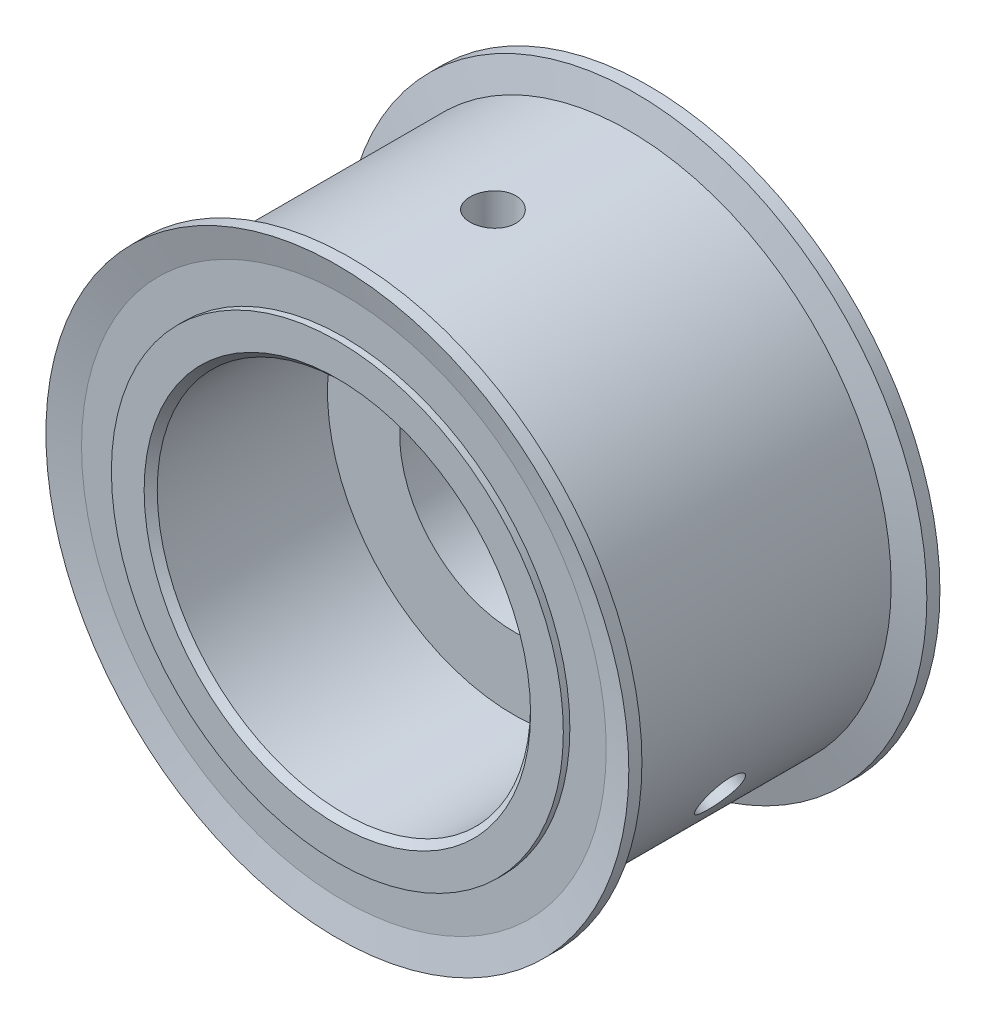
ISO-10303-21;
HEADER;
FILE_DESCRIPTION(('STEP AP214'),'2;1');
FILE_NAME('part.step','',(''),(''),'','','');
FILE_SCHEMA(('AUTOMOTIVE_DESIGN { 1 0 10303 214 1 1 1 1 }'));
ENDSEC;
DATA;
#1=APPLICATION_CONTEXT('core data for automotive mechanical design processes');
#2=APPLICATION_PROTOCOL_DEFINITION('international standard','automotive_design',2000,#1);
#3=PRODUCT_CONTEXT('',#1,'mechanical');
#4=PRODUCT('Part','Part','',(#3));
#5=PRODUCT_RELATED_PRODUCT_CATEGORY('part','',(#4));
#6=PRODUCT_DEFINITION_FORMATION('','',#4);
#7=PRODUCT_DEFINITION_CONTEXT('part definition',#1,'design');
#8=PRODUCT_DEFINITION('design','',#6,#7);
#9=PRODUCT_DEFINITION_SHAPE('','',#8);
#10=(LENGTH_UNIT() NAMED_UNIT(*) SI_UNIT(.MILLI.,.METRE.));
#11=(NAMED_UNIT(*) PLANE_ANGLE_UNIT() SI_UNIT($,.RADIAN.));
#12=(NAMED_UNIT(*) SI_UNIT($,.STERADIAN.) SOLID_ANGLE_UNIT());
#13=UNCERTAINTY_MEASURE_WITH_UNIT(LENGTH_MEASURE(1.E-05),#10,'distance_accuracy_value','');
#14=(GEOMETRIC_REPRESENTATION_CONTEXT(3) GLOBAL_UNCERTAINTY_ASSIGNED_CONTEXT((#13)) GLOBAL_UNIT_ASSIGNED_CONTEXT((#10,
#11,#12)) REPRESENTATION_CONTEXT('',''));
#15=CARTESIAN_POINT('',(0.,0.,0.));
#16=DIRECTION('',(0.,0.,1.));
#17=DIRECTION('',(1.,0.,0.));
#18=AXIS2_PLACEMENT_3D('',#15,#16,#17);
#19=CARTESIAN_POINT('',(0.,30.055,23.75));
#20=DIRECTION('',(0.,-1.,0.));
#21=DIRECTION('',(0.,0.,-1.));
#22=AXIS2_PLACEMENT_3D('',#19,#20,#21);
#23=PLANE('',#22);
#24=CARTESIAN_POINT('',(0.,30.055,23.75));
#25=DIRECTION('',(0.,1.,0.));
#26=DIRECTION('',(0.,0.,1.));
#27=AXIS2_PLACEMENT_3D('',#24,#25,#26);
#28=CIRCLE('',#27,3.5);
#29=CARTESIAN_POINT('',(0.,30.055,27.25));
#30=VERTEX_POINT('',#29);
#31=EDGE_CURVE('E89',#30,#30,#28,.T.);
#32=ORIENTED_EDGE('',*,*,#31,.T.);
#33=EDGE_LOOP('',(#32));
#34=FACE_BOUND('',#33,.T.);
#35=CARTESIAN_POINT('',(0.,30.055,23.75));
#36=DIRECTION('',(0.,1.,0.));
#37=DIRECTION('',(0.,0.,1.));
#38=AXIS2_PLACEMENT_3D('',#35,#36,#37);
#39=CIRCLE('',#38,2.49999999999999);
#40=CARTESIAN_POINT('',(0.,30.055,26.25));
#41=VERTEX_POINT('',#40);
#42=EDGE_CURVE('E90',#41,#41,#39,.T.);
#43=ORIENTED_EDGE('',*,*,#42,.F.);
#44=EDGE_LOOP('',(#43));
#45=FACE_BOUND('',#44,.T.);
#46=ADVANCED_FACE('F32',(#34,#45),#23,.F.);
#47=CARTESIAN_POINT('',(0.,34.5,47.5));
#48=DIRECTION('',(0.,0.,-1.));
#49=DIRECTION('',(-1.,0.,0.));
#50=AXIS2_PLACEMENT_3D('',#47,#48,#49);
#51=PLANE('',#50);
#52=CARTESIAN_POINT('',(0.,0.,47.5));
#53=DIRECTION('',(0.,0.,-1.));
#54=DIRECTION('',(-1.,0.,0.));
#55=AXIS2_PLACEMENT_3D('',#52,#53,#54);
#56=CIRCLE('',#55,29.5);
#57=CARTESIAN_POINT('',(-29.5,0.,47.5));
#58=VERTEX_POINT('',#57);
#59=EDGE_CURVE('E10',#58,#58,#56,.T.);
#60=ORIENTED_EDGE('',*,*,#59,.T.);
#61=EDGE_LOOP('',(#60));
#62=FACE_BOUND('',#61,.T.);
#63=CARTESIAN_POINT('',(0.,0.,47.5));
#64=DIRECTION('',(0.,0.,1.));
#65=DIRECTION('',(1.,0.,0.));
#66=AXIS2_PLACEMENT_3D('',#63,#64,#65);
#67=CIRCLE('',#66,34.5);
#68=CARTESIAN_POINT('',(34.5,0.,47.5));
#69=VERTEX_POINT('',#68);
#70=EDGE_CURVE('E103',#69,#69,#67,.T.);
#71=ORIENTED_EDGE('',*,*,#70,.T.);
#72=EDGE_LOOP('',(#71));
#73=FACE_BOUND('',#72,.T.);
#74=ADVANCED_FACE('F156',(#62,#73),#51,.F.);
#75=CARTESIAN_POINT('',(0.,34.5,0.));
#76=DIRECTION('',(0.,0.,1.));
#77=DIRECTION('',(1.,0.,0.));
#78=AXIS2_PLACEMENT_3D('',#75,#76,#77);
#79=PLANE('',#78);
#80=CARTESIAN_POINT('',(0.,0.,0.));
#81=DIRECTION('',(0.,0.,1.));
#82=DIRECTION('',(1.,0.,0.));
#83=AXIS2_PLACEMENT_3D('',#80,#81,#82);
#84=CIRCLE('',#83,34.5);
#85=CARTESIAN_POINT('',(34.5,0.,0.));
#86=VERTEX_POINT('',#85);
#87=EDGE_CURVE('E135',#86,#86,#84,.T.);
#88=ORIENTED_EDGE('',*,*,#87,.F.);
#89=EDGE_LOOP('',(#88));
#90=FACE_BOUND('',#89,.T.);
#91=CARTESIAN_POINT('',(0.,0.,0.));
#92=DIRECTION('',(0.,0.,1.));
#93=DIRECTION('',(1.,0.,0.));
#94=AXIS2_PLACEMENT_3D('',#91,#92,#93);
#95=CIRCLE('',#94,17.5);
#96=CARTESIAN_POINT('',(17.5,0.,0.));
#97=VERTEX_POINT('',#96);
#98=EDGE_CURVE('E100',#97,#97,#95,.T.);
#99=ORIENTED_EDGE('',*,*,#98,.T.);
#100=EDGE_LOOP('',(#99));
#101=FACE_BOUND('',#100,.T.);
#102=ADVANCED_FACE('F161',(#90,#101),#79,.F.);
#103=CARTESIAN_POINT('',(0.,0.,58.9307236143648));
#104=DIRECTION('',(0.,0.,1.));
#105=DIRECTION('',(1.,0.,0.));
#106=AXIS2_PLACEMENT_3D('',#103,#104,#105);
#107=CYLINDRICAL_SURFACE('',#106,34.5);
#108=CARTESIAN_POINT('',(0.,0.,1.00000000000001));
#109=DIRECTION('',(0.,0.,1.));
#110=DIRECTION('',(1.,0.,0.));
#111=AXIS2_PLACEMENT_3D('',#108,#109,#110);
#112=CIRCLE('',#111,34.5);
#113=CARTESIAN_POINT('',(34.5,0.,1.00000000000001));
#114=VERTEX_POINT('',#113);
#115=EDGE_CURVE('E133',#114,#114,#112,.T.);
#116=ORIENTED_EDGE('',*,*,#115,.F.);
#117=EDGE_LOOP('',(#116));
#118=FACE_BOUND('',#117,.T.);
#119=ORIENTED_EDGE('',*,*,#87,.T.);
#120=EDGE_LOOP('',(#119));
#121=FACE_BOUND('',#120,.T.);
#122=ADVANCED_FACE('F219',(#118,#121),#107,.T.);
#123=CARTESIAN_POINT('',(0.,40.055,1.00000000000001));
#124=DIRECTION('',(0.,0.,1.));
#125=DIRECTION('',(1.,0.,0.));
#126=AXIS2_PLACEMENT_3D('',#123,#124,#125);
#127=PLANE('',#126);
#128=CARTESIAN_POINT('',(0.,0.,1.00000000000001));
#129=DIRECTION('',(0.,0.,1.));
#130=DIRECTION('',(1.,0.,0.));
#131=AXIS2_PLACEMENT_3D('',#128,#129,#130);
#132=CIRCLE('',#131,40.055);
#133=CARTESIAN_POINT('',(40.055,0.,1.00000000000001));
#134=VERTEX_POINT('',#133);
#135=EDGE_CURVE('E130',#134,#134,#132,.T.);
#136=ORIENTED_EDGE('',*,*,#135,.F.);
#137=EDGE_LOOP('',(#136));
#138=FACE_BOUND('',#137,.T.);
#139=ORIENTED_EDGE('',*,*,#115,.T.);
#140=EDGE_LOOP('',(#139));
#141=FACE_BOUND('',#140,.T.);
#142=ADVANCED_FACE('F213',(#138,#141),#127,.F.);
#143=CARTESIAN_POINT('',(0.,0.,1.00000000000001));
#144=DIRECTION('',(0.,0.,-1.));
#145=DIRECTION('',(-1.,0.,0.));
#146=AXIS2_PLACEMENT_3D('',#143,#144,#145);
#147=CONICAL_SURFACE('',#146,40.055,1.34950865104239);
#148=CARTESIAN_POINT('',(0.,0.,0.));
#149=DIRECTION('',(0.,0.,1.));
#150=DIRECTION('',(1.,0.,0.));
#151=AXIS2_PLACEMENT_3D('',#148,#149,#150);
#152=CIRCLE('',#151,44.5);
#153=CARTESIAN_POINT('',(44.5,0.,0.));
#154=VERTEX_POINT('',#153);
#155=EDGE_CURVE('E127',#154,#154,#152,.T.);
#156=ORIENTED_EDGE('',*,*,#155,.F.);
#157=EDGE_LOOP('',(#156));
#158=FACE_BOUND('',#157,.T.);
#159=ORIENTED_EDGE('',*,*,#135,.T.);
#160=EDGE_LOOP('',(#159));
#161=FACE_BOUND('',#160,.T.);
#162=ADVANCED_FACE('F207',(#158,#161),#147,.F.);
#163=CARTESIAN_POINT('',(0.,0.,58.9307236143648));
#164=DIRECTION('',(0.,0.,1.));
#165=DIRECTION('',(1.,0.,0.));
#166=AXIS2_PLACEMENT_3D('',#163,#164,#165);
#167=CYLINDRICAL_SURFACE('',#166,44.5);
#168=CARTESIAN_POINT('',(0.,0.,1.99999999999999));
#169=DIRECTION('',(0.,0.,1.));
#170=DIRECTION('',(1.,0.,0.));
#171=AXIS2_PLACEMENT_3D('',#168,#169,#170);
#172=CIRCLE('',#171,44.5);
#173=CARTESIAN_POINT('',(44.5,0.,1.99999999999999));
#174=VERTEX_POINT('',#173);
#175=EDGE_CURVE('E124',#174,#174,#172,.T.);
#176=ORIENTED_EDGE('',*,*,#175,.F.);
#177=EDGE_LOOP('',(#176));
#178=FACE_BOUND('',#177,.T.);
#179=ORIENTED_EDGE('',*,*,#155,.T.);
#180=EDGE_LOOP('',(#179));
#181=FACE_BOUND('',#180,.T.);
#182=ADVANCED_FACE('F202',(#178,#181),#167,.T.);
#183=CARTESIAN_POINT('',(0.,0.,1.99999999999999));
#184=DIRECTION('',(0.,0.,-1.));
#185=DIRECTION('',(-1.,0.,0.));
#186=AXIS2_PLACEMENT_3D('',#183,#184,#185);
#187=CONICAL_SURFACE('',#186,44.5,1.34950865104239);
#188=CARTESIAN_POINT('',(0.,0.,3.));
#189=DIRECTION('',(0.,0.,1.));
#190=DIRECTION('',(1.,0.,0.));
#191=AXIS2_PLACEMENT_3D('',#188,#189,#190);
#192=CIRCLE('',#191,40.055);
#193=CARTESIAN_POINT('',(40.055,0.,3.));
#194=VERTEX_POINT('',#193);
#195=EDGE_CURVE('E121',#194,#194,#192,.T.);
#196=ORIENTED_EDGE('',*,*,#195,.F.);
#197=EDGE_LOOP('',(#196));
#198=FACE_BOUND('',#197,.T.);
#199=ORIENTED_EDGE('',*,*,#175,.T.);
#200=EDGE_LOOP('',(#199));
#201=FACE_BOUND('',#200,.T.);
#202=ADVANCED_FACE('F192',(#198,#201),#187,.T.);
#203=CARTESIAN_POINT('',(0.,0.,58.9307236143648));
#204=DIRECTION('',(0.,0.,1.));
#205=DIRECTION('',(1.,0.,0.));
#206=AXIS2_PLACEMENT_3D('',#203,#204,#205);
#207=CYLINDRICAL_SURFACE('',#206,40.055);
#208=CARTESIAN_POINT('',(36.30596574761,-16.9198072132448,23.75));
#209=CARTESIAN_POINT('',(36.3059632235783,-16.9198156345097,23.553806520305));
#210=CARTESIAN_POINT('',(36.2989563616902,-16.934872983296,23.3574803431471));
#211=CARTESIAN_POINT('',(36.2710039456976,-16.9946563516064,22.9702625894534));
#212=CARTESIAN_POINT('',(36.2500426956457,-17.0394157799582,22.7793773853586));
#213=CARTESIAN_POINT('',(36.1944824087478,-17.1571174131409,22.4087056791033));
#214=CARTESIAN_POINT('',(36.1598912245386,-17.2300433898535,22.2289128551321));
#215=CARTESIAN_POINT('',(36.0775929379017,-17.4017047887254,21.8854248458655));
#216=CARTESIAN_POINT('',(36.0298885942962,-17.500434781872,21.7217262843903));
#217=CARTESIAN_POINT('',(35.9219866832275,-17.7208619563187,21.4145718856317));
#218=CARTESIAN_POINT('',(35.8617582709718,-17.842615773267,21.2711675234144));
#219=CARTESIAN_POINT('',(35.7299372266278,-18.1051412611975,21.0091147256924));
#220=CARTESIAN_POINT('',(35.6583440930524,-18.2459137713701,20.8904673831669));
#221=CARTESIAN_POINT('',(35.5050725158124,-18.5424028045196,20.6811235292922));
#222=CARTESIAN_POINT('',(35.4233781913663,-18.69814277102,20.5904718348179));
#223=CARTESIAN_POINT('',(35.2517868434471,-19.019666647224,20.4399792172312));
#224=CARTESIAN_POINT('',(35.1618899763069,-19.1854503654828,20.3801377070495));
#225=CARTESIAN_POINT('',(34.9763251215707,-19.5216921695479,20.2931130777752));
#226=CARTESIAN_POINT('',(34.8806725790607,-19.6921371299136,20.2658463204221));
#227=CARTESIAN_POINT('',(34.6859424548007,-20.0331466668198,20.2444865915869));
#228=CARTESIAN_POINT('',(34.5868649424708,-20.2037112408673,20.2503929481179));
#229=CARTESIAN_POINT('',(34.3884238724187,-20.5396518151435,20.2951435023053));
#230=CARTESIAN_POINT('',(34.2890618333802,-20.7050407057078,20.3338977609611));
#231=CARTESIAN_POINT('',(34.0928376849555,-21.0265770231715,20.4431041207878));
#232=CARTESIAN_POINT('',(33.9959756013624,-21.1827243547432,20.5135565488639));
#233=CARTESIAN_POINT('',(33.8077698119123,-21.4818301148208,20.6842592328285));
#234=CARTESIAN_POINT('',(33.7164337465168,-21.6247704204788,20.7845496597135));
#235=CARTESIAN_POINT('',(33.5425338722474,-21.8935403794271,21.0120522973215));
#236=CARTESIAN_POINT('',(33.4599702593405,-22.0193696504931,21.1392651092716));
#237=CARTESIAN_POINT('',(33.3062910131491,-22.2511448734123,21.4175080703633));
#238=CARTESIAN_POINT('',(33.2352145583225,-22.3570229747346,21.5686163907751));
#239=CARTESIAN_POINT('',(33.1074840708786,-22.5457435172242,21.8900888502207));
#240=CARTESIAN_POINT('',(33.0508300519401,-22.6285859365432,22.0604530075175));
#241=CARTESIAN_POINT('',(32.9541142783193,-22.7692050225997,22.4156573154005));
#242=CARTESIAN_POINT('',(32.914054868954,-22.8269781463468,22.6004995077817));
#243=CARTESIAN_POINT('',(32.8521259474749,-22.9160165182035,22.9793858567227));
#244=CARTESIAN_POINT('',(32.8302560143245,-22.9472823798837,23.1734298001774));
#245=CARTESIAN_POINT('',(32.8056278666785,-22.9824775487663,23.5645253576344));
#246=CARTESIAN_POINT('',(32.8028067677632,-22.9864968032265,23.7615649209949));
#247=CARTESIAN_POINT('',(32.8162232509019,-22.9673387219858,24.153661129507));
#248=CARTESIAN_POINT('',(32.8324606372214,-22.9441616655967,24.3487177950026));
#249=CARTESIAN_POINT('',(32.883299520291,-22.8712393148181,24.7309962832855));
#250=CARTESIAN_POINT('',(32.917871820728,-22.8215362593407,24.91823005324));
#251=CARTESIAN_POINT('',(33.0039986660961,-22.6968017108283,25.2799182445754));
#252=CARTESIAN_POINT('',(33.0555535100896,-22.6217697717513,25.4543724408421));
#253=CARTESIAN_POINT('',(33.1738193310878,-22.4479792060441,25.786049267274));
#254=CARTESIAN_POINT('',(33.2405695028338,-22.3491591820189,25.9432257487509));
#255=CARTESIAN_POINT('',(33.3866563294301,-22.1303291010434,26.2354187117788));
#256=CARTESIAN_POINT('',(33.4659932222491,-22.0103186434552,26.3704347742596));
#257=CARTESIAN_POINT('',(33.6346271523912,-21.7517522086681,26.6148483691288));
#258=CARTESIAN_POINT('',(33.7239508477645,-21.6131463874364,26.7241747957997));
#259=CARTESIAN_POINT('',(33.9092715092462,-21.321214369666,26.9136175410775));
#260=CARTESIAN_POINT('',(34.0052684029786,-21.1678883327726,26.9937341764283));
#261=CARTESIAN_POINT('',(34.2006040577039,-20.8508106240515,27.1223613758143));
#262=CARTESIAN_POINT('',(34.2999379925355,-20.6870737265361,27.1709156782745));
#263=CARTESIAN_POINT('',(34.4989398389438,-20.3534734083611,27.2351828398489));
#264=CARTESIAN_POINT('',(34.5986077434631,-20.1836101164337,27.2508963886273));
#265=CARTESIAN_POINT('',(34.7949972409809,-19.8431270435108,27.2490275839308));
#266=CARTESIAN_POINT('',(34.8917275410276,-19.6725116660799,27.231555946664));
#267=CARTESIAN_POINT('',(35.079951355173,-19.3348754862105,27.1640438976544));
#268=CARTESIAN_POINT('',(35.1714448627602,-19.1678546882417,27.1140034454165));
#269=CARTESIAN_POINT('',(35.3469107201742,-18.8423232365535,26.9828029719464));
#270=CARTESIAN_POINT('',(35.4308836218594,-18.6838119587523,26.9016452363972));
#271=CARTESIAN_POINT('',(35.5894304541386,-18.3800125681928,26.7105263897741));
#272=CARTESIAN_POINT('',(35.664004511993,-18.2347242764025,26.6005656687552));
#273=CARTESIAN_POINT('',(35.8024775495655,-17.9613258155591,26.3545464751038));
#274=CARTESIAN_POINT('',(35.8663417300958,-17.8332719017785,26.2184058996433));
#275=CARTESIAN_POINT('',(35.9819592734035,-17.598828557239,25.9240439366185));
#276=CARTESIAN_POINT('',(36.0337097058221,-17.4924443692702,25.7658172210844));
#277=CARTESIAN_POINT('',(36.1243186189401,-17.3045533241123,25.4314377311704));
#278=CARTESIAN_POINT('',(36.1631508176243,-17.2230972094534,25.2552493533699));
#279=CARTESIAN_POINT('',(36.2271535217901,-17.0880662438326,24.8903249113287));
#280=CARTESIAN_POINT('',(36.2523396680797,-17.0344594754702,24.7016034920107));
#281=CARTESIAN_POINT('',(36.2823287185602,-16.97045581429,24.3848154680584));
#282=CARTESIAN_POINT('',(36.2911859319756,-16.9514909892251,24.2587836757226));
#283=CARTESIAN_POINT('',(36.3030052585541,-16.9261639687054,24.0051866354448));
#284=CARTESIAN_POINT('',(36.3059673894609,-16.9198017353178,23.8776213921196));
#285=CARTESIAN_POINT('',(36.30596574761,-16.9198072132448,23.75));
#286=B_SPLINE_CURVE_WITH_KNOTS('',3,(#208,#209,#210,#211,#212,#213,#214,#215,#216,#217,#218,
#219,#220,#221,#222,#223,#224,#225,#226,#227,#228,#229,#230,#231,#232,#233,#234,#235,#236,#237,
#238,#239,#240,#241,#242,#243,#244,#245,#246,#247,#248,#249,#250,#251,#252,#253,#254,#255,#256,
#257,#258,#259,#260,#261,#262,#263,#264,#265,#266,#267,#268,#269,#270,#271,#272,#273,#274,#275,
#276,#277,#278,#279,#280,#281,#282,#283,#284,#285),.UNSPECIFIED.,.T.,.F.,(4,2,2,2,2,2,2,2,2,2,2,
2,2,2,2,2,2,2,2,2,2,2,2,2,2,2,2,2,2,2,2,2,2,2,2,2,2,2,4),(0.,0.588114451442172,1.17689153641607,
1.76532990308698,2.35364456532047,2.94342568816245,3.53323284330667,4.12397935545634,
4.71471461087384,5.30392982430116,5.89313310205306,6.48072830744089,7.06832957287399,
7.65672553547559,8.24513463944476,8.83551006738782,9.42588605526835,10.0163454525774,
10.6067911819933,11.195286762252,11.783776298593,12.3713315321509,12.9588971131025,
13.5479957836067,14.1371055931271,14.727827268104,15.3185425372446,15.908437450393,
16.4983199754716,17.0862379233888,17.6741566023088,18.2620321046322,18.8498996462552,
19.4396417902488,20.029526447884,20.6206039832322,21.2110025974347,21.5935648061716,
21.9761258634267),.UNSPECIFIED.);
#287=CARTESIAN_POINT('',(36.30596574761,-16.9198072132448,23.75));
#288=VERTEX_POINT('',#287);
#289=EDGE_CURVE('E43',#288,#288,#286,.T.);
#290=ORIENTED_EDGE('',*,*,#289,.T.);
#291=EDGE_LOOP('',(#290));
#292=FACE_BOUND('',#291,.T.);
#293=CARTESIAN_POINT('',(0.,40.055,27.25));
#294=CARTESIAN_POINT('',(-0.196195091913983,40.0549980035695,27.2499914464052));
#295=CARTESIAN_POINT('',(-0.392522876083729,40.053543157102,27.2334477061984));
#296=CARTESIAN_POINT('',(-0.779743968807647,40.0478793688906,27.1676964441643));
#297=CARTESIAN_POINT('',(-0.970630906181819,40.0436673264563,27.1184521470103));
#298=CARTESIAN_POINT('',(-1.34130627711322,40.0329650107293,26.9887368536929));
#299=CARTESIAN_POINT('',(-1.52110101780322,40.0264760464205,26.9082837963965));
#300=CARTESIAN_POINT('',(-1.86459223730481,40.0119471087442,26.7184674782124));
#301=CARTESIAN_POINT('',(-2.02829209469687,40.0039074619445,26.6091103026272));
#302=CARTESIAN_POINT('',(-2.33544502461648,39.9871539055789,26.3642614714731));
#303=CARTESIAN_POINT('',(-2.47884703385911,39.9784383779752,26.2287058640499));
#304=CARTESIAN_POINT('',(-2.7408952918844,39.9613288852561,25.9354435817762));
#305=CARTESIAN_POINT('',(-2.85954044047289,39.952934934445,25.7777359230102));
#306=CARTESIAN_POINT('',(-3.0688820044522,39.9374018246309,25.4443343892415));
#307=CARTESIAN_POINT('',(-3.15953319883226,39.9302647038008,25.2686120170434));
#308=CARTESIAN_POINT('',(-3.31002476967342,39.9180722841311,24.9043675362292));
#309=CARTESIAN_POINT('',(-3.36986573916652,39.9130169452221,24.7158456740553));
#310=CARTESIAN_POINT('',(-3.45688923223841,39.905574350721,24.3318677418437));
#311=CARTESIAN_POINT('',(-3.48415534896616,39.9031802669561,24.1364307516151));
#312=CARTESIAN_POINT('',(-3.50551343161705,39.9013097721972,23.7437407068067));
#313=CARTESIAN_POINT('',(-3.49960607641087,39.9018333014964,23.546487689473));
#314=CARTESIAN_POINT('',(-3.45485394596231,39.9057326673437,23.1563385003557));
#315=CARTESIAN_POINT('',(-3.41610011487456,39.9091006282393,22.9634318070781));
#316=CARTESIAN_POINT('',(-3.30689645162769,39.9182970321075,22.5868715070693));
#317=CARTESIAN_POINT('',(-3.23644628293893,39.924125501204,22.4032179986049));
#318=CARTESIAN_POINT('',(-3.06574826713897,39.9375952651673,22.0500880674758));
#319=CARTESIAN_POINT('',(-2.96545972021031,39.9452390332258,21.8806314166929));
#320=CARTESIAN_POINT('',(-2.73796108962057,39.9614758979904,21.5609217047501));
#321=CARTESIAN_POINT('',(-2.61075040575157,39.9700690158594,21.4106690718485));
#322=CARTESIAN_POINT('',(-2.33250894803874,39.9872714030673,21.1331037957159));
#323=CARTESIAN_POINT('',(-2.18139956999274,39.9958806296535,21.0058699322082));
#324=CARTESIAN_POINT('',(-1.85992410214172,40.0121177392272,20.7785633437436));
#325=CARTESIAN_POINT('',(-1.68955799772269,40.01974562147,20.6784906393997));
#326=CARTESIAN_POINT('',(-1.33435317534095,40.0331622658078,20.5083515756488));
#327=CARTESIAN_POINT('',(-1.1495127222482,40.0389508069876,20.438288820254));
#328=CARTESIAN_POINT('',(-0.770630151931283,40.0480340991053,20.3302142182351));
#329=CARTESIAN_POINT('',(-0.576588244798591,40.0513289069521,20.2922016401998));
#330=CARTESIAN_POINT('',(-0.185493613972502,40.0550461933334,20.2494054666245));
#331=CARTESIAN_POINT('',(0.0115471194759136,40.0554780757476,20.2445130797369));
#332=CARTESIAN_POINT('',(0.403645923510567,40.0534459885363,20.2678110021149));
#333=CARTESIAN_POINT('',(0.59870401443846,40.0509820486519,20.2960009716138));
#334=CARTESIAN_POINT('',(0.980989488495527,40.0434414055186,20.3845732074668));
#335=CARTESIAN_POINT('',(1.16822866960278,40.0383688047786,20.4449049314504));
#336=CARTESIAN_POINT('',(1.52992703452426,40.0261805026754,20.5959963855795));
#337=CARTESIAN_POINT('',(1.70438599684771,40.0190647659137,20.6867566429223));
#338=CARTESIAN_POINT('',(2.03606603940723,40.0035640271791,20.8964013936464));
#339=CARTESIAN_POINT('',(2.19324149676179,39.995175798691,21.0153578249356));
#340=CARTESIAN_POINT('',(2.48543206981567,39.9780829424773,21.2779144447657));
#341=CARTESIAN_POINT('',(2.62044676199094,39.9693783087087,21.421515104186));
#342=CARTESIAN_POINT('',(2.86485744027774,39.9526057642994,21.7297565656509));
#343=CARTESIAN_POINT('',(2.97418234056156,39.9445396604355,21.8944538450262));
#344=CARTESIAN_POINT('',(3.16362240684723,39.9299835176486,22.2399328553339));
#345=CARTESIAN_POINT('',(3.24373788924878,39.9234934616538,22.4207144120132));
#346=CARTESIAN_POINT('',(3.37236431636771,39.9128346824393,22.792980341534));
#347=CARTESIAN_POINT('',(3.42091850009857,39.9086627844837,22.9844496796788));
#348=CARTESIAN_POINT('',(3.48518472672618,39.9031022523147,23.3728612897795));
#349=CARTESIAN_POINT('',(3.5008974702538,39.9017135587252,23.5698034448889));
#350=CARTESIAN_POINT('',(3.49902633524599,39.9018776307166,23.9628637668256));
#351=CARTESIAN_POINT('',(3.48155414094391,39.9034205299998,24.1589824790814));
#352=CARTESIAN_POINT('',(3.41404227642055,39.9092529630346,24.5454883793592));
#353=CARTESIAN_POINT('',(3.36400255915971,39.9135425007532,24.7358755591023));
#354=CARTESIAN_POINT('',(3.23280497931036,39.9243822612601,25.1055193884438));
#355=CARTESIAN_POINT('',(3.15164942767604,39.9309323161575,25.2847768634903));
#356=CARTESIAN_POINT('',(2.9605361142672,39.9455553880662,25.6271416438669));
#357=CARTESIAN_POINT('',(2.85057873839468,39.953628384672,25.7902491655424));
#358=CARTESIAN_POINT('',(2.60456320326951,39.9704201006164,26.0962559129046));
#359=CARTESIAN_POINT('',(2.46842217755974,39.97914081459,26.2390884085132));
#360=CARTESIAN_POINT('',(2.17405830352158,39.9962271117973,26.4999358310107));
#361=CARTESIAN_POINT('',(2.01583013269727,40.0045926087961,26.6179447587536));
#362=CARTESIAN_POINT('',(1.68144947781427,40.0200424951199,26.8259700874482));
#363=CARTESIAN_POINT('',(1.50526165143474,40.0271242791412,26.9159298228738));
#364=CARTESIAN_POINT('',(1.14033838327123,40.0391788750584,27.0648726430828));
#365=CARTESIAN_POINT('',(0.951617582959853,40.0441540994661,27.1238911814583));
#366=CARTESIAN_POINT('',(0.634827838515019,40.0501638969456,27.194316328098));
#367=CARTESIAN_POINT('',(0.508793577602792,40.0519691343877,27.215169776203));
#368=CARTESIAN_POINT('',(0.255191590705968,40.0543878334788,27.2430143736025));
#369=CARTESIAN_POINT('',(0.12762386927691,40.0550012986675,27.2500055640681));
#370=CARTESIAN_POINT('',(0.,40.055,27.25));
#371=B_SPLINE_CURVE_WITH_KNOTS('',3,(#293,#294,#295,#296,#297,#298,#299,#300,#301,#302,#303,
#304,#305,#306,#307,#308,#309,#310,#311,#312,#313,#314,#315,#316,#317,#318,#319,#320,#321,#322,
#323,#324,#325,#326,#327,#328,#329,#330,#331,#332,#333,#334,#335,#336,#337,#338,#339,#340,#341,
#342,#343,#344,#345,#346,#347,#348,#349,#350,#351,#352,#353,#354,#355,#356,#357,#358,#359,#360,
#361,#362,#363,#364,#365,#366,#367,#368,#369,#370),.UNSPECIFIED.,.T.,.F.,(4,2,2,2,2,2,2,2,2,2,2,
2,2,2,2,2,2,2,2,2,2,2,2,2,2,2,2,2,2,2,2,2,2,2,2,2,2,2,4),(0.,0.588119293925899,1.17690111452599,
1.76534500227311,2.35366510106186,2.94343988751842,3.53324087796979,4.12398969946208,
4.71472714985746,5.30394537901664,5.8931515503027,6.48073165774915,7.06831800385914,
7.65670952637832,8.24511416800724,8.8354959736911,9.42587822742143,10.0163313625999,
10.6067710227884,11.195270294811,11.7837635228004,12.3713340747038,12.9589148072376,
13.5480111053385,14.1371186606054,14.7278376200775,15.3185501806254,15.908451749081,
16.4983407325995,17.0862479561869,17.6741560289318,18.2620204465552,18.8498769880645,
19.4396255483054,20.0295164705652,20.6205914941205,21.2109877531029,21.5935573784683,
21.9761258675931),.UNSPECIFIED.);
#372=CARTESIAN_POINT('',(0.,40.055,27.25));
#373=VERTEX_POINT('',#372);
#374=EDGE_CURVE('E47',#373,#373,#371,.T.);
#375=ORIENTED_EDGE('',*,*,#374,.T.);
#376=EDGE_LOOP('',(#375));
#377=FACE_BOUND('',#376,.T.);
#378=CARTESIAN_POINT('',(0.,0.,44.5));
#379=DIRECTION('',(0.,0.,1.));
#380=DIRECTION('',(1.,0.,0.));
#381=AXIS2_PLACEMENT_3D('',#378,#379,#380);
#382=CIRCLE('',#381,40.055);
#383=CARTESIAN_POINT('',(40.055,0.,44.5));
#384=VERTEX_POINT('',#383);
#385=EDGE_CURVE('E118',#384,#384,#382,.T.);
#386=ORIENTED_EDGE('',*,*,#385,.F.);
#387=EDGE_LOOP('',(#386));
#388=FACE_BOUND('',#387,.T.);
#389=ORIENTED_EDGE('',*,*,#195,.T.);
#390=EDGE_LOOP('',(#389));
#391=FACE_BOUND('',#390,.T.);
#392=ADVANCED_FACE('F58',(#292,#377,#388,#391),#207,.T.);
#393=CARTESIAN_POINT('',(0.,0.,44.5));
#394=DIRECTION('',(0.,0.,1.));
#395=DIRECTION('',(1.,0.,0.));
#396=AXIS2_PLACEMENT_3D('',#393,#394,#395);
#397=CONICAL_SURFACE('',#396,40.055,1.34950865104239);
#398=CARTESIAN_POINT('',(0.,0.,45.5));
#399=DIRECTION('',(0.,0.,1.));
#400=DIRECTION('',(1.,0.,0.));
#401=AXIS2_PLACEMENT_3D('',#398,#399,#400);
#402=CIRCLE('',#401,44.5);
#403=CARTESIAN_POINT('',(44.5,0.,45.5));
#404=VERTEX_POINT('',#403);
#405=EDGE_CURVE('E115',#404,#404,#402,.T.);
#406=ORIENTED_EDGE('',*,*,#405,.F.);
#407=EDGE_LOOP('',(#406));
#408=FACE_BOUND('',#407,.T.);
#409=ORIENTED_EDGE('',*,*,#385,.T.);
#410=EDGE_LOOP('',(#409));
#411=FACE_BOUND('',#410,.T.);
#412=ADVANCED_FACE('F185',(#408,#411),#397,.T.);
#413=CARTESIAN_POINT('',(0.,0.,58.9307236143648));
#414=DIRECTION('',(0.,0.,1.));
#415=DIRECTION('',(1.,0.,0.));
#416=AXIS2_PLACEMENT_3D('',#413,#414,#415);
#417=CYLINDRICAL_SURFACE('',#416,44.5);
#418=CARTESIAN_POINT('',(0.,0.,47.5));
#419=DIRECTION('',(0.,0.,1.));
#420=DIRECTION('',(1.,0.,0.));
#421=AXIS2_PLACEMENT_3D('',#418,#419,#420);
#422=CIRCLE('',#421,44.5);
#423=CARTESIAN_POINT('',(44.5,0.,47.5));
#424=VERTEX_POINT('',#423);
#425=EDGE_CURVE('E112',#424,#424,#422,.T.);
#426=ORIENTED_EDGE('',*,*,#425,.F.);
#427=EDGE_LOOP('',(#426));
#428=FACE_BOUND('',#427,.T.);
#429=ORIENTED_EDGE('',*,*,#405,.T.);
#430=EDGE_LOOP('',(#429));
#431=FACE_BOUND('',#430,.T.);
#432=ADVANCED_FACE('F182',(#428,#431),#417,.T.);
#433=CARTESIAN_POINT('',(0.,0.,47.5));
#434=DIRECTION('',(0.,0.,1.));
#435=DIRECTION('',(1.,0.,0.));
#436=AXIS2_PLACEMENT_3D('',#433,#434,#435);
#437=CONICAL_SURFACE('',#436,44.5,1.34950865104239);
#438=CARTESIAN_POINT('',(0.,0.,46.5));
#439=DIRECTION('',(0.,0.,1.));
#440=DIRECTION('',(1.,0.,0.));
#441=AXIS2_PLACEMENT_3D('',#438,#439,#440);
#442=CIRCLE('',#441,40.055);
#443=CARTESIAN_POINT('',(40.055,0.,46.5));
#444=VERTEX_POINT('',#443);
#445=EDGE_CURVE('E109',#444,#444,#442,.T.);
#446=ORIENTED_EDGE('',*,*,#445,.F.);
#447=EDGE_LOOP('',(#446));
#448=FACE_BOUND('',#447,.T.);
#449=ORIENTED_EDGE('',*,*,#425,.T.);
#450=EDGE_LOOP('',(#449));
#451=FACE_BOUND('',#450,.T.);
#452=ADVANCED_FACE('F178',(#448,#451),#437,.F.);
#453=CARTESIAN_POINT('',(0.,34.5,46.5));
#454=DIRECTION('',(0.,0.,-1.));
#455=DIRECTION('',(-1.,0.,0.));
#456=AXIS2_PLACEMENT_3D('',#453,#454,#455);
#457=PLANE('',#456);
#458=CARTESIAN_POINT('',(0.,0.,46.5));
#459=DIRECTION('',(0.,0.,1.));
#460=DIRECTION('',(1.,0.,0.));
#461=AXIS2_PLACEMENT_3D('',#458,#459,#460);
#462=CIRCLE('',#461,34.5);
#463=CARTESIAN_POINT('',(34.5,0.,46.5));
#464=VERTEX_POINT('',#463);
#465=EDGE_CURVE('E106',#464,#464,#462,.T.);
#466=ORIENTED_EDGE('',*,*,#465,.F.);
#467=EDGE_LOOP('',(#466));
#468=FACE_BOUND('',#467,.T.);
#469=ORIENTED_EDGE('',*,*,#445,.T.);
#470=EDGE_LOOP('',(#469));
#471=FACE_BOUND('',#470,.T.);
#472=ADVANCED_FACE('F174',(#468,#471),#457,.F.);
#473=CARTESIAN_POINT('',(0.,0.,58.9307236143648));
#474=DIRECTION('',(0.,0.,1.));
#475=DIRECTION('',(1.,0.,0.));
#476=AXIS2_PLACEMENT_3D('',#473,#474,#475);
#477=CYLINDRICAL_SURFACE('',#476,34.5);
#478=ORIENTED_EDGE('',*,*,#70,.F.);
#479=EDGE_LOOP('',(#478));
#480=FACE_BOUND('',#479,.T.);
#481=ORIENTED_EDGE('',*,*,#465,.T.);
#482=EDGE_LOOP('',(#481));
#483=FACE_BOUND('',#482,.T.);
#484=ADVANCED_FACE('F170',(#480,#483),#477,.T.);
#485=CARTESIAN_POINT('',(0.,0.,2.98361352408043));
#486=DIRECTION('',(0.,0.,1.));
#487=DIRECTION('',(1.,0.,0.));
#488=AXIS2_PLACEMENT_3D('',#485,#486,#487);
#489=CYLINDRICAL_SURFACE('',#488,17.5);
#490=CARTESIAN_POINT('',(0.,0.,20.5));
#491=DIRECTION('',(0.,0.,1.));
#492=DIRECTION('',(1.,0.,0.));
#493=AXIS2_PLACEMENT_3D('',#490,#491,#492);
#494=CIRCLE('',#493,17.5);
#495=CARTESIAN_POINT('',(17.5,0.,20.5));
#496=VERTEX_POINT('',#495);
#497=EDGE_CURVE('E97',#496,#496,#494,.T.);
#498=ORIENTED_EDGE('',*,*,#497,.T.);
#499=EDGE_LOOP('',(#498));
#500=FACE_BOUND('',#499,.T.);
#501=ORIENTED_EDGE('',*,*,#98,.F.);
#502=EDGE_LOOP('',(#501));
#503=FACE_BOUND('',#502,.T.);
#504=ADVANCED_FACE('F166',(#500,#503),#489,.F.);
#505=CARTESIAN_POINT('',(0.,17.5,20.5));
#506=DIRECTION('',(0.,0.,1.));
#507=DIRECTION('',(1.,0.,0.));
#508=AXIS2_PLACEMENT_3D('',#505,#506,#507);
#509=PLANE('',#508);
#510=CARTESIAN_POINT('',(0.,0.,20.5));
#511=DIRECTION('',(0.,0.,1.));
#512=DIRECTION('',(1.,0.,0.));
#513=AXIS2_PLACEMENT_3D('',#510,#511,#512);
#514=CIRCLE('',#513,28.5);
#515=CARTESIAN_POINT('',(28.5,0.,20.5));
#516=VERTEX_POINT('',#515);
#517=EDGE_CURVE('E94',#516,#516,#514,.T.);
#518=ORIENTED_EDGE('',*,*,#517,.T.);
#519=EDGE_LOOP('',(#518));
#520=FACE_BOUND('',#519,.T.);
#521=ORIENTED_EDGE('',*,*,#497,.F.);
#522=EDGE_LOOP('',(#521));
#523=FACE_BOUND('',#522,.T.);
#524=ADVANCED_FACE('F150',(#520,#523),#509,.T.);
#525=CARTESIAN_POINT('',(0.,0.,2.98361352408043));
#526=DIRECTION('',(0.,0.,1.));
#527=DIRECTION('',(1.,0.,0.));
#528=AXIS2_PLACEMENT_3D('',#525,#526,#527);
#529=CYLINDRICAL_SURFACE('',#528,28.5);
#530=CARTESIAN_POINT('',(0.,0.,46.5));
#531=DIRECTION('',(0.,0.,-1.));
#532=DIRECTION('',(-1.,0.,0.));
#533=AXIS2_PLACEMENT_3D('',#530,#531,#532);
#534=CIRCLE('',#533,28.5);
#535=CARTESIAN_POINT('',(-28.5,0.,46.5));
#536=VERTEX_POINT('',#535);
#537=EDGE_CURVE('E39',#536,#536,#534,.F.);
#538=ORIENTED_EDGE('',*,*,#537,.T.);
#539=EDGE_LOOP('',(#538));
#540=FACE_BOUND('',#539,.T.);
#541=CARTESIAN_POINT('',(25.8365817062884,-12.0300060571174,23.75));
#542=CARTESIAN_POINT('',(25.8365799087088,-12.0300120741385,23.6098640437321));
#543=CARTESIAN_POINT('',(25.8315787045871,-12.0407690229623,23.4696333584289));
#544=CARTESIAN_POINT('',(25.8116271297953,-12.0834779350275,23.1930539362898));
#545=CARTESIAN_POINT('',(25.7966655616721,-12.115453752416,23.056709748759));
#546=CARTESIAN_POINT('',(25.7570070992665,-12.1995382316054,22.7919490307004));
#547=CARTESIAN_POINT('',(25.7323158180279,-12.2516352851785,22.663527978654));
#548=CARTESIAN_POINT('',(25.6735689316234,-12.374265979901,22.4181837169506));
#549=CARTESIAN_POINT('',(25.6395152933938,-12.4447957483697,22.3012580992163));
#550=CARTESIAN_POINT('',(25.5624855774124,-12.6022620980229,22.0818630559258));
#551=CARTESIAN_POINT('',(25.5194873078477,-12.6892394361963,21.9794306710165));
#552=CARTESIAN_POINT('',(25.4253726389082,-12.8767779505744,21.7922481893205));
#553=CARTESIAN_POINT('',(25.374255880969,-12.9773397267254,21.7074988739139));
#554=CARTESIAN_POINT('',(25.2648146686247,-13.1891375646486,21.5579636178468));
#555=CARTESIAN_POINT('',(25.2064787754538,-13.3003905026725,21.4932099427264));
#556=CARTESIAN_POINT('',(25.0839425005859,-13.5300684550699,21.3857104730973));
#557=CARTESIAN_POINT('',(25.0197422314418,-13.6484933317802,21.3429642563116));
#558=CARTESIAN_POINT('',(24.8872140234889,-13.8886764128743,21.2808003296162));
#559=CARTESIAN_POINT('',(24.8188972196948,-14.0104251774202,21.2613224147071));
#560=CARTESIAN_POINT('',(24.6798100148908,-14.2540044489676,21.2460618418404));
#561=CARTESIAN_POINT('',(24.609039663962,-14.3758349542509,21.2502787005147));
#562=CARTESIAN_POINT('',(24.4672892319762,-14.6157835277764,21.2822388276306));
#563=CARTESIAN_POINT('',(24.396310263153,-14.7339108852748,21.3099173557375));
#564=CARTESIAN_POINT('',(24.2561318811013,-14.9635616233845,21.3879144172755));
#565=CARTESIAN_POINT('',(24.1869324863553,-15.0750849354229,21.4382331857444));
#566=CARTESIAN_POINT('',(24.0524699101145,-15.2887102244567,21.5601542298429));
#567=CARTESIAN_POINT('',(23.9872122209497,-15.390799156018,21.6317854148234));
#568=CARTESIAN_POINT('',(23.8629598312297,-15.5827546372845,21.7942769554717));
#569=CARTESIAN_POINT('',(23.8039652716899,-15.6726209118071,21.8851377439594));
#570=CARTESIAN_POINT('',(23.6941509526448,-15.8381543151938,22.0838739774094));
#571=CARTESIAN_POINT('',(23.6433593930649,-15.9137726054007,22.1918056932324));
#572=CARTESIAN_POINT('',(23.5520799598556,-16.048556851373,22.4214241413982));
#573=CARTESIAN_POINT('',(23.5115920961137,-16.1077227913507,22.5431108869402));
#574=CARTESIAN_POINT('',(23.4424721065634,-16.2081534130227,22.7968256709488));
#575=CARTESIAN_POINT('',(23.4138416755076,-16.24941553581,22.9288551844764));
#576=CARTESIAN_POINT('',(23.3695796480463,-16.3130089638127,23.1994881606747));
#577=CARTESIAN_POINT('',(23.3539477483816,-16.3353407106789,23.3380914698973));
#578=CARTESIAN_POINT('',(23.3363425964266,-16.360481461102,23.6174437179682));
#579=CARTESIAN_POINT('',(23.334324054414,-16.3633551988399,23.7581839794921));
#580=CARTESIAN_POINT('',(23.3439069667534,-16.3496811745944,24.0382488308617));
#581=CARTESIAN_POINT('',(23.3555082801207,-16.333133613649,24.1775734353465));
#582=CARTESIAN_POINT('',(23.3918338992666,-16.2810657357499,24.45062525531));
#583=CARTESIAN_POINT('',(23.4165371728072,-16.2455758258814,24.5843610721913));
#584=CARTESIAN_POINT('',(23.4780782383748,-16.1565081420038,24.8427057177789));
#585=CARTESIAN_POINT('',(23.5149162457234,-16.1029300470331,24.9673143844828));
#586=CARTESIAN_POINT('',(23.5994215360019,-15.9788276248335,25.2042273645647));
#587=CARTESIAN_POINT('',(23.647117037915,-15.9082591109,25.3164984643694));
#588=CARTESIAN_POINT('',(23.7514993291536,-15.7519867267587,25.5252133860519));
#589=CARTESIAN_POINT('',(23.8081862897911,-15.6662825681716,25.6216569062995));
#590=CARTESIAN_POINT('',(23.9286748104685,-15.4816241393125,25.7962483227272));
#591=CARTESIAN_POINT('',(23.9924955598407,-15.3826339800391,25.8743450302343));
#592=CARTESIAN_POINT('',(24.1249007481591,-15.1741356880061,26.0096744683149));
#593=CARTESIAN_POINT('',(24.1934851350926,-15.0646276700826,26.0669074266503));
#594=CARTESIAN_POINT('',(24.3330355266943,-14.8381613726979,26.1587971111161));
#595=CARTESIAN_POINT('',(24.4039980651794,-14.7212137306819,26.1934853099575));
#596=CARTESIAN_POINT('',(24.5461557475301,-14.4829373734569,26.2394036326658));
#597=CARTESIAN_POINT('',(24.6173508864375,-14.3616087510862,26.2506342533307));
#598=CARTESIAN_POINT('',(24.7576283290923,-14.1184092910011,26.2493125435397));
#599=CARTESIAN_POINT('',(24.8267169222742,-13.9965416399614,26.2368399110509));
#600=CARTESIAN_POINT('',(24.9611475610362,-13.7553691085325,26.1886321722433));
#601=CARTESIAN_POINT('',(25.0264896019963,-13.6360642313036,26.1528970372398));
#602=CARTESIAN_POINT('',(25.1517965013998,-13.4035290297556,26.0591994081014));
#603=CARTESIAN_POINT('',(25.2117617618194,-13.2902982515824,26.0012385773056));
#604=CARTESIAN_POINT('',(25.3249757409493,-13.0732781860941,25.8647437790253));
#605=CARTESIAN_POINT('',(25.3782245492914,-12.969488772788,25.7862100861315));
#606=CARTESIAN_POINT('',(25.4770975634123,-12.7741747792172,25.6104995623631));
#607=CARTESIAN_POINT('',(25.522696712536,-12.6826906920888,25.5132636211002));
#608=CARTESIAN_POINT('',(25.6052456459863,-12.5151963264206,25.3030187290727));
#609=CARTESIAN_POINT('',(25.6421933378826,-12.4391897918398,25.1900059730759));
#610=CARTESIAN_POINT('',(25.7068840342933,-12.3049459401732,24.9511731398758));
#611=CARTESIAN_POINT('',(25.7346081535529,-12.2467450995721,24.8253274668515));
#612=CARTESIAN_POINT('',(25.7803031264985,-12.1502611903315,24.5646714728968));
#613=CARTESIAN_POINT('',(25.7982851422471,-12.1119553290127,24.4298716110027));
#614=CARTESIAN_POINT('',(25.8197000673303,-12.0662114052386,24.2035701204584));
#615=CARTESIAN_POINT('',(25.8260259310603,-12.0526547202092,24.1135219231136));
#616=CARTESIAN_POINT('',(25.8344673289743,-12.0345501022349,23.9323291841799));
#617=CARTESIAN_POINT('',(25.8365828759501,-12.03000214192,23.8411846459227));
#618=CARTESIAN_POINT('',(25.8365817062884,-12.0300060571174,23.75));
#619=B_SPLINE_CURVE_WITH_KNOTS('',3,(#541,#542,#543,#544,#545,#546,#547,#548,#549,#550,#551,
#552,#553,#554,#555,#556,#557,#558,#559,#560,#561,#562,#563,#564,#565,#566,#567,#568,#569,#570,
#571,#572,#573,#574,#575,#576,#577,#578,#579,#580,#581,#582,#583,#584,#585,#586,#587,#588,#589,
#590,#591,#592,#593,#594,#595,#596,#597,#598,#599,#600,#601,#602,#603,#604,#605,#606,#607,#608,
#609,#610,#611,#612,#613,#614,#615,#616,#617,#618),.UNSPECIFIED.,.T.,.F.,(4,2,2,2,2,2,2,2,2,2,2,
2,2,2,2,2,2,2,2,2,2,2,2,2,2,2,2,2,2,2,2,2,2,2,2,2,2,2,4),(0.,0.420074922603535,
0.840622893211021,1.26092860524277,1.68114608268329,2.10241883565537,2.523710199901,
2.94567786185202,3.36763742682716,3.78850282158566,4.20935963081588,4.62905889049603,
5.04876250734907,5.46903804946214,5.88932305214549,6.31102347658702,6.73272430569051,
7.15448538663866,7.57623662751535,7.99658406631092,8.41692715395386,8.83659750897161,
9.25627531112115,9.67705658151433,10.0978458699124,10.5197955999128,10.9417407235042,
11.3630955349782,11.7844414226668,12.2043731158984,12.6243053269419,13.044206116994,
13.4641013028232,13.8853460915028,14.30669265691,14.728896694437,15.1506159610566,
15.4239540855093,15.6972913795109),.UNSPECIFIED.);
#620=CARTESIAN_POINT('',(25.8365817062884,-12.0300060571174,23.75));
#621=VERTEX_POINT('',#620);
#622=EDGE_CURVE('E379',#621,#621,#619,.T.);
#623=ORIENTED_EDGE('',*,*,#622,.F.);
#624=EDGE_LOOP('',(#623));
#625=FACE_BOUND('',#624,.T.);
#626=CARTESIAN_POINT('',(0.,28.5,26.25));
#627=CARTESIAN_POINT('',(-0.140137125835809,28.4999985688699,26.2499938913689));
#628=CARTESIAN_POINT('',(-0.280368976936221,28.4989553893636,26.2381773077879));
#629=CARTESIAN_POINT('',(-0.55695082133506,28.4948942409203,26.1912136917821));
#630=CARTESIAN_POINT('',(-0.693296266243168,28.4918740498708,26.1560404063533));
#631=CARTESIAN_POINT('',(-0.958059642797954,28.4842000836098,26.0633900335687));
#632=CARTESIAN_POINT('',(-1.0864820853155,28.4795472482084,26.0059257757133));
#633=CARTESIAN_POINT('',(-1.33182867588891,28.4691294094061,25.8703481030023));
#634=CARTESIAN_POINT('',(-1.44875523376348,28.4633646398473,25.7922390285218));
#635=CARTESIAN_POINT('',(-1.66814921158122,28.4513514435934,25.6173526118677));
#636=CARTESIAN_POINT('',(-1.77057988958201,28.4451018479189,25.5205292533031));
#637=CARTESIAN_POINT('',(-1.95775907803097,28.4328331406723,25.311060238615));
#638=CARTESIAN_POINT('',(-2.04250680186519,28.4268140393633,25.198413878989));
#639=CARTESIAN_POINT('',(-2.19204039665557,28.4156754390892,24.9602719002385));
#640=CARTESIAN_POINT('',(-2.25679370892063,28.410557413189,24.8347557621287));
#641=CARTESIAN_POINT('',(-2.36429241911254,28.4018141534062,24.5745799855425));
#642=CARTESIAN_POINT('',(-2.40703824364186,28.3981888905875,24.4399205243614));
#643=CARTESIAN_POINT('',(-2.46920134618685,28.3928516652568,24.1656506384025));
#644=CARTESIAN_POINT('',(-2.48867879642797,28.3911347684972,24.0260539492272));
#645=CARTESIAN_POINT('',(-2.50393817516542,28.3897931546313,23.7455630145057));
#646=CARTESIAN_POINT('',(-2.49972059202383,28.3901683944053,23.6046687957618));
#647=CARTESIAN_POINT('',(-2.46775932134659,28.3929641657848,23.3259952237363));
#648=CARTESIAN_POINT('',(-2.44008110331573,28.3953790055936,23.1882082966161));
#649=CARTESIAN_POINT('',(-2.36208599770543,28.4019729675629,22.9192432719521));
#650=CARTESIAN_POINT('',(-2.31176886810772,28.4061521085844,22.7880652450766));
#651=CARTESIAN_POINT('',(-2.18985121031279,28.4158103410251,22.5358334916771));
#652=CARTESIAN_POINT('',(-2.11822138921154,28.4212912194918,22.4147939952505));
#653=CARTESIAN_POINT('',(-1.95573275570035,28.4329337566856,22.1864308107758));
#654=CARTESIAN_POINT('',(-1.86487351120855,28.4390954307087,22.0791074310135));
#655=CARTESIAN_POINT('',(-1.66613836863129,28.4514306264256,21.8808423820873));
#656=CARTESIAN_POINT('',(-1.55820588554733,28.457604117577,21.7899574205263));
#657=CARTESIAN_POINT('',(-1.32858525484953,28.4692475160834,21.6275878140505));
#658=CARTESIAN_POINT('',(-1.20689709668466,28.4747174228987,21.5561031840166));
#659=CARTESIAN_POINT('',(-0.953181939157091,28.4843385608039,21.4345666485352));
#660=CARTESIAN_POINT('',(-0.821153687229199,28.4884896318253,21.384517344458));
#661=CARTESIAN_POINT('',(-0.550523451908658,28.4950036081389,21.3073123355539));
#662=CARTESIAN_POINT('',(-0.4119216197773,28.4973665545556,21.2801561042157));
#663=CARTESIAN_POINT('',(-0.132570044260402,28.5000327639182,21.2495794115785));
#664=CARTESIAN_POINT('',(0.00817106561935854,28.5003428221176,21.246080641038));
#665=CARTESIAN_POINT('',(0.288237798926676,28.4988864865765,21.262712913119));
#666=CARTESIAN_POINT('',(0.427563436991452,28.4971201143303,21.2828437111387));
#667=CARTESIAN_POINT('',(0.700620324343106,28.4917138920861,21.3460987602096));
#668=CARTESIAN_POINT('',(0.834360066794083,28.4880770072643,21.3891866231087));
#669=CARTESIAN_POINT('',(1.09271209302196,28.4793381780474,21.497095473628));
#670=CARTESIAN_POINT('',(1.2173242174247,28.4742362080786,21.5619168406191));
#671=CARTESIAN_POINT('',(1.45423953139207,28.4631218913146,21.7116488148682));
#672=CARTESIAN_POINT('',(1.56650988875087,28.4571072129433,21.7966111955263));
#673=CARTESIAN_POINT('',(1.77522307750192,28.4448507568377,21.9841387749265));
#674=CARTESIAN_POINT('',(1.87166560403434,28.4386089747319,22.0867043126452));
#675=CARTESIAN_POINT('',(2.04625490452923,28.4265815997567,22.3068670250137));
#676=CARTESIAN_POINT('',(2.12435050437269,28.4207973120365,22.4245048620235));
#677=CARTESIAN_POINT('',(2.2596779983892,28.4103587039132,22.6712709206904));
#678=CARTESIAN_POINT('',(2.31691012007208,28.4057043711885,22.8003990170309));
#679=CARTESIAN_POINT('',(2.40879924433555,28.3980602132594,23.066300324168));
#680=CARTESIAN_POINT('',(2.44348735721851,28.3950680950627,23.2030627153678));
#681=CARTESIAN_POINT('',(2.48940500197861,28.3910796260819,23.4804980813747));
#682=CARTESIAN_POINT('',(2.50063503861086,28.3900832323551,23.6211709719723));
#683=CARTESIAN_POINT('',(2.49931163830959,28.3901997295619,23.901925576528));
#684=CARTESIAN_POINT('',(2.48683860151406,28.3913054900542,24.0420076794258));
#685=CARTESIAN_POINT('',(2.43863099585999,28.395486541847,24.3180790867466));
#686=CARTESIAN_POINT('',(2.40289639357109,28.3985618359779,24.4540683852872));
#687=CARTESIAN_POINT('',(2.3092008628424,28.4063335468009,24.7180977087677));
#688=CARTESIAN_POINT('',(2.25124161626729,28.41102984082,24.8461383343771));
#689=CARTESIAN_POINT('',(2.11475083208966,28.4215146207169,25.0906854058394));
#690=CARTESIAN_POINT('',(2.03621956606356,28.4273030921763,25.207192003928));
#691=CARTESIAN_POINT('',(1.86051169695461,28.4393434187971,25.4257755469277));
#692=CARTESIAN_POINT('',(1.76327542944772,28.4455967163863,25.5278044514801));
#693=CARTESIAN_POINT('',(1.55302915189234,28.4578489078699,25.7141367457529));
#694=CARTESIAN_POINT('',(1.4400153405833,28.4638477400009,25.7984358515544));
#695=CARTESIAN_POINT('',(1.20118166217834,28.4749270835759,25.9470415661907));
#696=CARTESIAN_POINT('',(1.07533638861517,28.4800057155821,26.0113074472348));
#697=CARTESIAN_POINT('',(0.814681244926202,28.4886508730198,26.1177133368565));
#698=CARTESIAN_POINT('',(0.679881831334317,28.4922191275472,26.1598786596363));
#699=CARTESIAN_POINT('',(0.453579092348955,28.4965302178004,26.2102028461463));
#700=CARTESIAN_POINT('',(0.36352910461348,28.4978254274307,26.2251068073415));
#701=CARTESIAN_POINT('',(0.182332778053836,28.499560782863,26.2450073568454));
#702=CARTESIAN_POINT('',(0.09118644251688,28.5000009312283,26.250003974852));
#703=CARTESIAN_POINT('',(0.,28.5,26.25));
#704=B_SPLINE_CURVE_WITH_KNOTS('',3,(#626,#627,#628,#629,#630,#631,#632,#633,#634,#635,#636,
#637,#638,#639,#640,#641,#642,#643,#644,#645,#646,#647,#648,#649,#650,#651,#652,#653,#654,#655,
#656,#657,#658,#659,#660,#661,#662,#663,#664,#665,#666,#667,#668,#669,#670,#671,#672,#673,#674,
#675,#676,#677,#678,#679,#680,#681,#682,#683,#684,#685,#686,#687,#688,#689,#690,#691,#692,#693,
#694,#695,#696,#697,#698,#699,#700,#701,#702,#703),.UNSPECIFIED.,.T.,.F.,(4,2,2,2,2,2,2,2,2,2,2,
2,2,2,2,2,2,2,2,2,2,2,2,2,2,2,2,2,2,2,2,2,2,2,2,2,2,2,4),(0.,0.420078435532647,
0.840629841539041,1.2609395587532,1.68116098006513,2.10242913636858,2.52371602850082,
2.94568536537558,3.36764652230977,3.78851410531723,4.20937301414362,4.6290613215173,
5.0487541156197,5.46902643586932,5.88930820056886,6.31101325227392,6.73271862744209,
7.15447516587229,7.57622200418268,7.99657211978461,8.41691788416446,8.83659935198152,
9.25628814596455,9.67706769667902,10.0978553510772,10.5198031095472,10.9417462666687,
11.3631059068984,11.7844564805013,12.2043803957399,12.6243049144736,13.0441976614105,
13.4640848655166,13.8853343082088,14.3066854176267,14.7288876349992,15.1506051950207,
15.4239486984644,15.6972913825377),.UNSPECIFIED.);
#705=CARTESIAN_POINT('',(0.,28.5,26.25));
#706=VERTEX_POINT('',#705);
#707=EDGE_CURVE('E83',#706,#706,#704,.T.);
#708=ORIENTED_EDGE('',*,*,#707,.F.);
#709=EDGE_LOOP('',(#708));
#710=FACE_BOUND('',#709,.T.);
#711=ORIENTED_EDGE('',*,*,#517,.F.);
#712=EDGE_LOOP('',(#711));
#713=FACE_BOUND('',#712,.T.);
#714=ADVANCED_FACE('F145',(#540,#625,#710,#713),#529,.F.);
#715=CARTESIAN_POINT('',(0.,40.055,23.75));
#716=DIRECTION('',(0.,1.,0.));
#717=DIRECTION('',(0.,0.,1.));
#718=AXIS2_PLACEMENT_3D('',#715,#716,#717);
#719=CYLINDRICAL_SURFACE('',#718,3.5);
#720=ORIENTED_EDGE('',*,*,#31,.F.);
#721=EDGE_LOOP('',(#720));
#722=FACE_BOUND('',#721,.T.);
#723=ORIENTED_EDGE('',*,*,#374,.F.);
#724=EDGE_LOOP('',(#723));
#725=FACE_BOUND('',#724,.T.);
#726=ADVANCED_FACE('F79',(#722,#725),#719,.F.);
#727=CARTESIAN_POINT('',(0.,30.055,23.75));
#728=DIRECTION('',(0.,1.,0.));
#729=DIRECTION('',(0.,0.,1.));
#730=AXIS2_PLACEMENT_3D('',#727,#728,#729);
#731=CYLINDRICAL_SURFACE('',#730,2.49999999999999);
#732=ORIENTED_EDGE('',*,*,#42,.T.);
#733=EDGE_LOOP('',(#732));
#734=FACE_BOUND('',#733,.T.);
#735=ORIENTED_EDGE('',*,*,#707,.T.);
#736=EDGE_LOOP('',(#735));
#737=FACE_BOUND('',#736,.T.);
#738=ADVANCED_FACE('F68',(#734,#737),#731,.F.);
#739=CARTESIAN_POINT('',(34.6886475485856,-20.0275000000002,23.75));
#740=DIRECTION('',(0.866025403784436,-0.500000000000004,0.));
#741=DIRECTION('',(0.500000000000004,0.866025403784436,0.));
#742=AXIS2_PLACEMENT_3D('',#739,#740,#741);
#743=CYLINDRICAL_SURFACE('',#742,3.5);
#744=CARTESIAN_POINT('',(26.0283935107412,-15.0275000000001,23.75));
#745=DIRECTION('',(0.866025403784436,-0.500000000000004,0.));
#746=DIRECTION('',(0.500000000000004,0.866025403784436,0.));
#747=AXIS2_PLACEMENT_3D('',#744,#745,#746);
#748=CIRCLE('',#747,3.5);
#749=CARTESIAN_POINT('',(27.7783935107412,-11.9964110867546,23.75));
#750=VERTEX_POINT('',#749);
#751=EDGE_CURVE('E384',#750,#750,#748,.T.);
#752=ORIENTED_EDGE('',*,*,#751,.F.);
#753=EDGE_LOOP('',(#752));
#754=FACE_BOUND('',#753,.T.);
#755=ORIENTED_EDGE('',*,*,#289,.F.);
#756=EDGE_LOOP('',(#755));
#757=FACE_BOUND('',#756,.T.);
#758=ADVANCED_FACE('F62',(#754,#757),#743,.F.);
#759=CARTESIAN_POINT('',(26.0283935107412,-15.0275000000001,23.75));
#760=DIRECTION('',(-0.866025403784436,0.500000000000004,0.));
#761=DIRECTION('',(-0.500000000000004,-0.866025403784436,0.));
#762=AXIS2_PLACEMENT_3D('',#759,#760,#761);
#763=PLANE('',#762);
#764=CARTESIAN_POINT('',(26.0283935107412,-15.0275000000001,23.75));
#765=DIRECTION('',(0.866025403784436,-0.500000000000004,0.));
#766=DIRECTION('',(0.500000000000004,0.866025403784436,0.));
#767=AXIS2_PLACEMENT_3D('',#764,#765,#766);
#768=CIRCLE('',#767,2.49999999999999);
#769=CARTESIAN_POINT('',(27.2783935107412,-12.862436490539,23.75));
#770=VERTEX_POINT('',#769);
#771=EDGE_CURVE('E385',#770,#770,#768,.T.);
#772=ORIENTED_EDGE('',*,*,#771,.F.);
#773=EDGE_LOOP('',(#772));
#774=FACE_BOUND('',#773,.T.);
#775=ORIENTED_EDGE('',*,*,#751,.T.);
#776=EDGE_LOOP('',(#775));
#777=FACE_BOUND('',#776,.T.);
#778=ADVANCED_FACE('F67',(#774,#777),#763,.F.);
#779=CARTESIAN_POINT('',(26.0283935107412,-15.0275000000001,23.75));
#780=DIRECTION('',(0.866025403784436,-0.500000000000004,0.));
#781=DIRECTION('',(0.500000000000004,0.866025403784436,0.));
#782=AXIS2_PLACEMENT_3D('',#779,#780,#781);
#783=CYLINDRICAL_SURFACE('',#782,2.49999999999999);
#784=ORIENTED_EDGE('',*,*,#771,.T.);
#785=EDGE_LOOP('',(#784));
#786=FACE_BOUND('',#785,.T.);
#787=ORIENTED_EDGE('',*,*,#622,.T.);
#788=EDGE_LOOP('',(#787));
#789=FACE_BOUND('',#788,.T.);
#790=ADVANCED_FACE('F74',(#786,#789),#783,.F.);
#791=CARTESIAN_POINT('',(0.,0.,46.5));
#792=DIRECTION('',(0.,0.,1.));
#793=DIRECTION('',(1.,0.,0.));
#794=AXIS2_PLACEMENT_3D('',#791,#792,#793);
#795=CONICAL_SURFACE('',#794,28.5,0.785398163397455);
#796=ORIENTED_EDGE('',*,*,#59,.F.);
#797=EDGE_LOOP('',(#796));
#798=FACE_BOUND('',#797,.T.);
#799=ORIENTED_EDGE('',*,*,#537,.F.);
#800=EDGE_LOOP('',(#799));
#801=FACE_BOUND('',#800,.T.);
#802=ADVANCED_FACE('F34',(#798,#801),#795,.F.);
#803=CLOSED_SHELL('',(#46,#74,#102,#122,#142,#162,#182,#202,#392,#412,#432,#452,#472,#484,#504,
#524,#714,#726,#738,#758,#778,#790,#802));
#804=MANIFOLD_SOLID_BREP('B2',#803);
#805=ADVANCED_BREP_SHAPE_REPRESENTATION('',(#18,#804),#14);
#806=SHAPE_DEFINITION_REPRESENTATION(#9,#805);
ENDSEC;
END-ISO-10303-21;
